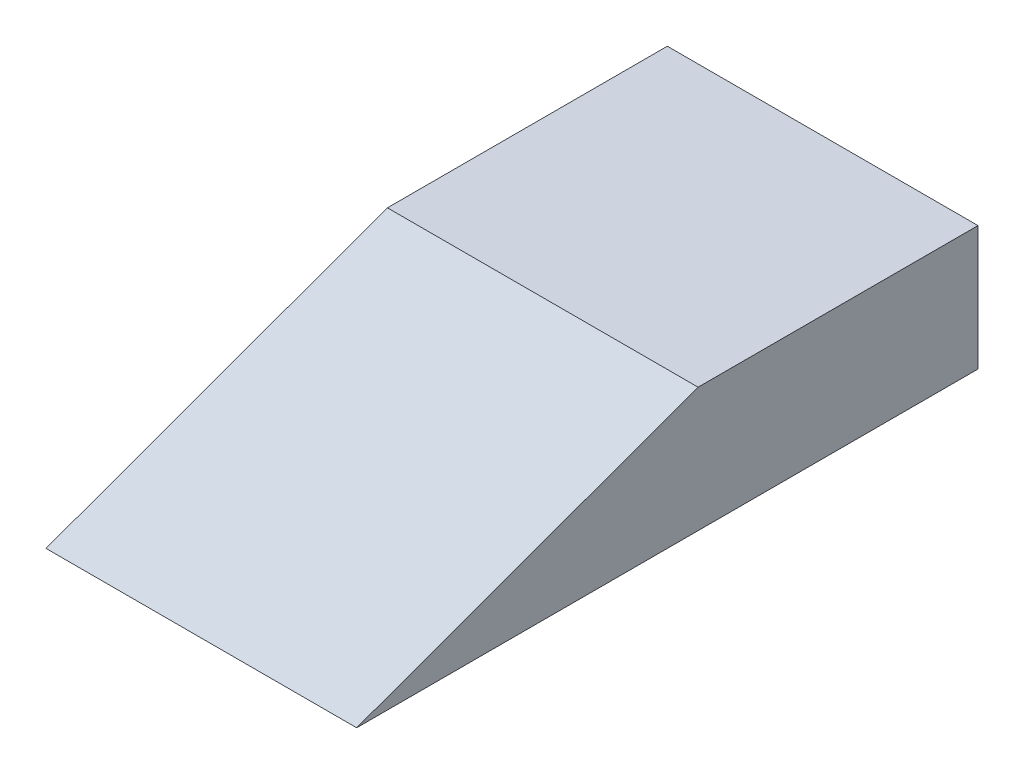
ISO-10303-21;
HEADER;
FILE_DESCRIPTION(('STEP AP214'),'2;1');
FILE_NAME('part.step','',(''),(''),'','','');
FILE_SCHEMA(('AUTOMOTIVE_DESIGN { 1 0 10303 214 1 1 1 1 }'));
ENDSEC;
DATA;
#1=APPLICATION_CONTEXT('core data for automotive mechanical design processes');
#2=APPLICATION_PROTOCOL_DEFINITION('international standard','automotive_design',2000,#1);
#3=PRODUCT_CONTEXT('',#1,'mechanical');
#4=PRODUCT('Part','Part','',(#3));
#5=PRODUCT_RELATED_PRODUCT_CATEGORY('part','',(#4));
#6=PRODUCT_DEFINITION_FORMATION('','',#4);
#7=PRODUCT_DEFINITION_CONTEXT('part definition',#1,'design');
#8=PRODUCT_DEFINITION('design','',#6,#7);
#9=PRODUCT_DEFINITION_SHAPE('','',#8);
#10=(LENGTH_UNIT() NAMED_UNIT(*) SI_UNIT(.MILLI.,.METRE.));
#11=(NAMED_UNIT(*) PLANE_ANGLE_UNIT() SI_UNIT($,.RADIAN.));
#12=(NAMED_UNIT(*) SI_UNIT($,.STERADIAN.) SOLID_ANGLE_UNIT());
#13=UNCERTAINTY_MEASURE_WITH_UNIT(LENGTH_MEASURE(1.E-05),#10,'distance_accuracy_value','');
#14=(GEOMETRIC_REPRESENTATION_CONTEXT(3) GLOBAL_UNCERTAINTY_ASSIGNED_CONTEXT((#13)) GLOBAL_UNIT_ASSIGNED_CONTEXT((#10,
#11,#12)) REPRESENTATION_CONTEXT('',''));
#15=CARTESIAN_POINT('',(0.,0.,0.));
#16=DIRECTION('',(0.,0.,1.));
#17=DIRECTION('',(1.,0.,0.));
#18=AXIS2_PLACEMENT_3D('',#15,#16,#17);
#19=CARTESIAN_POINT('',(500.,0.,-1000.));
#20=DIRECTION('',(0.,1.,0.));
#21=DIRECTION('',(0.,0.,1.));
#22=AXIS2_PLACEMENT_3D('',#19,#20,#21);
#23=PLANE('',#22);
#24=DIRECTION('',(0.,0.,-1.));
#25=VECTOR('',#24,1.);
#26=CARTESIAN_POINT('',(0.,0.,-1000.));
#27=LINE('',#26,#25);
#28=CARTESIAN_POINT('',(0.,0.,0.));
#29=VERTEX_POINT('',#28);
#30=CARTESIAN_POINT('',(0.,0.,-1000.));
#31=VERTEX_POINT('',#30);
#32=EDGE_CURVE('E102',#29,#31,#27,.T.);
#33=ORIENTED_EDGE('',*,*,#32,.T.);
#34=DIRECTION('',(-1.,0.,0.));
#35=VECTOR('',#34,1.);
#36=CARTESIAN_POINT('',(500.,0.,-1000.));
#37=LINE('',#36,#35);
#38=CARTESIAN_POINT('',(500.,0.,-1000.));
#39=VERTEX_POINT('',#38);
#40=EDGE_CURVE('E11',#39,#31,#37,.T.);
#41=ORIENTED_EDGE('',*,*,#40,.F.);
#42=DIRECTION('',(0.,0.,-1.));
#43=VECTOR('',#42,1.);
#44=CARTESIAN_POINT('',(500.,0.,-1000.));
#45=LINE('',#44,#43);
#46=CARTESIAN_POINT('',(500.,0.,0.));
#47=VERTEX_POINT('',#46);
#48=EDGE_CURVE('E90',#47,#39,#45,.T.);
#49=ORIENTED_EDGE('',*,*,#48,.F.);
#50=DIRECTION('',(-1.,0.,0.));
#51=VECTOR('',#50,1.);
#52=CARTESIAN_POINT('',(500.,0.,0.));
#53=LINE('',#52,#51);
#54=EDGE_CURVE('E98',#47,#29,#53,.T.);
#55=ORIENTED_EDGE('',*,*,#54,.T.);
#56=EDGE_LOOP('',(#33,#41,#49,#55));
#57=FACE_BOUND('',#56,.T.);
#58=ADVANCED_FACE('F39',(#57),#23,.F.);
#59=CARTESIAN_POINT('',(500.,200.,-1000.));
#60=DIRECTION('',(0.,0.,1.));
#61=DIRECTION('',(1.,0.,0.));
#62=AXIS2_PLACEMENT_3D('',#59,#60,#61);
#63=PLANE('',#62);
#64=DIRECTION('',(0.,1.,0.));
#65=VECTOR('',#64,1.);
#66=CARTESIAN_POINT('',(0.,200.,-1000.));
#67=LINE('',#66,#65);
#68=CARTESIAN_POINT('',(0.,200.,-1000.));
#69=VERTEX_POINT('',#68);
#70=EDGE_CURVE('E94',#31,#69,#67,.T.);
#71=ORIENTED_EDGE('',*,*,#70,.T.);
#72=DIRECTION('',(-1.,0.,0.));
#73=VECTOR('',#72,1.);
#74=CARTESIAN_POINT('',(500.,200.,-1000.));
#75=LINE('',#74,#73);
#76=CARTESIAN_POINT('',(500.,200.,-1000.));
#77=VERTEX_POINT('',#76);
#78=EDGE_CURVE('E47',#77,#69,#75,.T.);
#79=ORIENTED_EDGE('',*,*,#78,.F.);
#80=DIRECTION('',(0.,1.,0.));
#81=VECTOR('',#80,1.);
#82=CARTESIAN_POINT('',(500.,200.,-1000.));
#83=LINE('',#82,#81);
#84=EDGE_CURVE('E85',#39,#77,#83,.T.);
#85=ORIENTED_EDGE('',*,*,#84,.F.);
#86=ORIENTED_EDGE('',*,*,#40,.T.);
#87=EDGE_LOOP('',(#71,#79,#85,#86));
#88=FACE_BOUND('',#87,.T.);
#89=ADVANCED_FACE('F93',(#88),#63,.F.);
#90=CARTESIAN_POINT('',(500.,200.,-549.495483890935));
#91=DIRECTION('',(0.,-1.,0.));
#92=DIRECTION('',(0.,0.,-1.));
#93=AXIS2_PLACEMENT_3D('',#90,#91,#92);
#94=PLANE('',#93);
#95=DIRECTION('',(0.,0.,1.));
#96=VECTOR('',#95,1.);
#97=CARTESIAN_POINT('',(0.,200.,-549.495483890935));
#98=LINE('',#97,#96);
#99=CARTESIAN_POINT('',(0.,200.,-549.495483890935));
#100=VERTEX_POINT('',#99);
#101=EDGE_CURVE('E72',#69,#100,#98,.T.);
#102=ORIENTED_EDGE('',*,*,#101,.T.);
#103=DIRECTION('',(-1.,0.,0.));
#104=VECTOR('',#103,1.);
#105=CARTESIAN_POINT('',(500.,200.,-549.495483890935));
#106=LINE('',#105,#104);
#107=CARTESIAN_POINT('',(500.,200.,-549.495483890935));
#108=VERTEX_POINT('',#107);
#109=EDGE_CURVE('E95',#108,#100,#106,.T.);
#110=ORIENTED_EDGE('',*,*,#109,.F.);
#111=DIRECTION('',(0.,0.,1.));
#112=VECTOR('',#111,1.);
#113=CARTESIAN_POINT('',(500.,200.,-549.495483890935));
#114=LINE('',#113,#112);
#115=EDGE_CURVE('E88',#77,#108,#114,.T.);
#116=ORIENTED_EDGE('',*,*,#115,.F.);
#117=ORIENTED_EDGE('',*,*,#78,.T.);
#118=EDGE_LOOP('',(#102,#110,#116,#117));
#119=FACE_BOUND('',#118,.T.);
#120=ADVANCED_FACE('F96',(#119),#94,.F.);
#121=CARTESIAN_POINT('',(500.,0.,0.));
#122=DIRECTION('',(0.,-0.93969262078591,-0.342020143325663));
#123=DIRECTION('',(0.,0.342020143325663,-0.93969262078591));
#124=AXIS2_PLACEMENT_3D('',#121,#122,#123);
#125=PLANE('',#124);
#126=DIRECTION('',(0.,-0.342020143325663,0.93969262078591));
#127=VECTOR('',#126,1.);
#128=CARTESIAN_POINT('',(0.,0.,0.));
#129=LINE('',#128,#127);
#130=EDGE_CURVE('E78',#100,#29,#129,.T.);
#131=ORIENTED_EDGE('',*,*,#130,.T.);
#132=ORIENTED_EDGE('',*,*,#54,.F.);
#133=DIRECTION('',(0.,-0.342020143325663,0.93969262078591));
#134=VECTOR('',#133,1.);
#135=CARTESIAN_POINT('',(500.,0.,0.));
#136=LINE('',#135,#134);
#137=EDGE_CURVE('E55',#108,#47,#136,.T.);
#138=ORIENTED_EDGE('',*,*,#137,.F.);
#139=ORIENTED_EDGE('',*,*,#109,.T.);
#140=EDGE_LOOP('',(#131,#132,#138,#139));
#141=FACE_BOUND('',#140,.T.);
#142=ADVANCED_FACE('F109',(#141),#125,.F.);
#143=CARTESIAN_POINT('',(500.,0.,0.));
#144=DIRECTION('',(1.,0.,0.));
#145=DIRECTION('',(0.,0.,-1.));
#146=AXIS2_PLACEMENT_3D('',#143,#144,#145);
#147=PLANE('',#146);
#148=ORIENTED_EDGE('',*,*,#48,.T.);
#149=ORIENTED_EDGE('',*,*,#84,.T.);
#150=ORIENTED_EDGE('',*,*,#115,.T.);
#151=ORIENTED_EDGE('',*,*,#137,.T.);
#152=EDGE_LOOP('',(#148,#149,#150,#151));
#153=FACE_BOUND('',#152,.T.);
#154=ADVANCED_FACE('F86',(#153),#147,.T.);
#155=CARTESIAN_POINT('',(0.,0.,0.));
#156=DIRECTION('',(1.,0.,0.));
#157=DIRECTION('',(0.,0.,-1.));
#158=AXIS2_PLACEMENT_3D('',#155,#156,#157);
#159=PLANE('',#158);
#160=ORIENTED_EDGE('',*,*,#32,.F.);
#161=ORIENTED_EDGE('',*,*,#130,.F.);
#162=ORIENTED_EDGE('',*,*,#101,.F.);
#163=ORIENTED_EDGE('',*,*,#70,.F.);
#164=EDGE_LOOP('',(#160,#161,#162,#163));
#165=FACE_BOUND('',#164,.T.);
#166=ADVANCED_FACE('F112',(#165),#159,.F.);
#167=CLOSED_SHELL('',(#58,#89,#120,#142,#154,#166));
#168=MANIFOLD_SOLID_BREP('B2',#167);
#169=ADVANCED_BREP_SHAPE_REPRESENTATION('',(#18,#168),#14);
#170=SHAPE_DEFINITION_REPRESENTATION(#9,#169);
ENDSEC;
END-ISO-10303-21;
